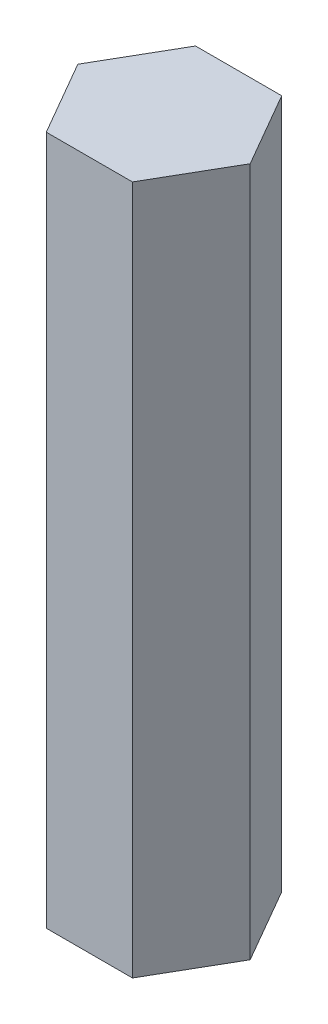
ISO-10303-21;
HEADER;
FILE_DESCRIPTION(('STEP AP214'),'2;1');
FILE_NAME('part.step','',(''),(''),'','','');
FILE_SCHEMA(('AUTOMOTIVE_DESIGN { 1 0 10303 214 1 1 1 1 }'));
ENDSEC;
DATA;
#1=APPLICATION_CONTEXT('core data for automotive mechanical design processes');
#2=APPLICATION_PROTOCOL_DEFINITION('international standard','automotive_design',2000,#1);
#3=PRODUCT_CONTEXT('',#1,'mechanical');
#4=PRODUCT('Part','Part','',(#3));
#5=PRODUCT_RELATED_PRODUCT_CATEGORY('part','',(#4));
#6=PRODUCT_DEFINITION_FORMATION('','',#4);
#7=PRODUCT_DEFINITION_CONTEXT('part definition',#1,'design');
#8=PRODUCT_DEFINITION('design','',#6,#7);
#9=PRODUCT_DEFINITION_SHAPE('','',#8);
#10=(LENGTH_UNIT() NAMED_UNIT(*) SI_UNIT(.MILLI.,.METRE.));
#11=(NAMED_UNIT(*) PLANE_ANGLE_UNIT() SI_UNIT($,.RADIAN.));
#12=(NAMED_UNIT(*) SI_UNIT($,.STERADIAN.) SOLID_ANGLE_UNIT());
#13=UNCERTAINTY_MEASURE_WITH_UNIT(LENGTH_MEASURE(1.E-05),#10,'distance_accuracy_value','');
#14=(GEOMETRIC_REPRESENTATION_CONTEXT(3) GLOBAL_UNCERTAINTY_ASSIGNED_CONTEXT((#13)) GLOBAL_UNIT_ASSIGNED_CONTEXT((#10,
#11,#12)) REPRESENTATION_CONTEXT('',''));
#15=CARTESIAN_POINT('',(0.,0.,0.));
#16=DIRECTION('',(0.,0.,1.));
#17=DIRECTION('',(1.,0.,0.));
#18=AXIS2_PLACEMENT_3D('',#15,#16,#17);
#19=CARTESIAN_POINT('',(3.,24.,0.));
#20=DIRECTION('',(-0.866025403784439,0.,0.5));
#21=DIRECTION('',(0.5,0.,0.866025403784439));
#22=AXIS2_PLACEMENT_3D('',#19,#20,#21);
#23=PLANE('',#22);
#24=DIRECTION('',(-0.5,0.,-0.866025403784439));
#25=VECTOR('',#24,1.);
#26=CARTESIAN_POINT('',(3.,0.,0.));
#27=LINE('',#26,#25);
#28=CARTESIAN_POINT('',(3.,0.,0.));
#29=VERTEX_POINT('',#28);
#30=CARTESIAN_POINT('',(1.5,0.,-2.59807621135332));
#31=VERTEX_POINT('',#30);
#32=EDGE_CURVE('E117',#29,#31,#27,.T.);
#33=ORIENTED_EDGE('',*,*,#32,.T.);
#34=DIRECTION('',(0.,-1.,0.));
#35=VECTOR('',#34,1.);
#36=CARTESIAN_POINT('',(1.5,24.,-2.59807621135332));
#37=LINE('',#36,#35);
#38=CARTESIAN_POINT('',(1.5,24.,-2.59807621135332));
#39=VERTEX_POINT('',#38);
#40=EDGE_CURVE('E11',#39,#31,#37,.T.);
#41=ORIENTED_EDGE('',*,*,#40,.F.);
#42=DIRECTION('',(-0.5,0.,-0.866025403784439));
#43=VECTOR('',#42,1.);
#44=CARTESIAN_POINT('',(3.,24.,0.));
#45=LINE('',#44,#43);
#46=CARTESIAN_POINT('',(3.,24.,0.));
#47=VERTEX_POINT('',#46);
#48=EDGE_CURVE('E127',#47,#39,#45,.T.);
#49=ORIENTED_EDGE('',*,*,#48,.F.);
#50=DIRECTION('',(0.,-1.,0.));
#51=VECTOR('',#50,1.);
#52=CARTESIAN_POINT('',(3.,24.,0.));
#53=LINE('',#52,#51);
#54=EDGE_CURVE('E113',#47,#29,#53,.T.);
#55=ORIENTED_EDGE('',*,*,#54,.T.);
#56=EDGE_LOOP('',(#33,#41,#49,#55));
#57=FACE_BOUND('',#56,.T.);
#58=ADVANCED_FACE('F33',(#57),#23,.F.);
#59=CARTESIAN_POINT('',(1.5,24.,-2.59807621135332));
#60=DIRECTION('',(0.,0.,1.));
#61=DIRECTION('',(1.,0.,0.));
#62=AXIS2_PLACEMENT_3D('',#59,#60,#61);
#63=PLANE('',#62);
#64=DIRECTION('',(-1.,0.,0.));
#65=VECTOR('',#64,1.);
#66=CARTESIAN_POINT('',(1.5,0.,-2.59807621135332));
#67=LINE('',#66,#65);
#68=CARTESIAN_POINT('',(-1.5,0.,-2.59807621135332));
#69=VERTEX_POINT('',#68);
#70=EDGE_CURVE('E120',#31,#69,#67,.T.);
#71=ORIENTED_EDGE('',*,*,#70,.T.);
#72=DIRECTION('',(0.,-1.,0.));
#73=VECTOR('',#72,1.);
#74=CARTESIAN_POINT('',(-1.5,24.,-2.59807621135332));
#75=LINE('',#74,#73);
#76=CARTESIAN_POINT('',(-1.5,24.,-2.59807621135332));
#77=VERTEX_POINT('',#76);
#78=EDGE_CURVE('E41',#77,#69,#75,.T.);
#79=ORIENTED_EDGE('',*,*,#78,.F.);
#80=DIRECTION('',(-1.,0.,0.));
#81=VECTOR('',#80,1.);
#82=CARTESIAN_POINT('',(1.5,24.,-2.59807621135332));
#83=LINE('',#82,#81);
#84=EDGE_CURVE('E86',#39,#77,#83,.T.);
#85=ORIENTED_EDGE('',*,*,#84,.F.);
#86=ORIENTED_EDGE('',*,*,#40,.T.);
#87=EDGE_LOOP('',(#71,#79,#85,#86));
#88=FACE_BOUND('',#87,.T.);
#89=ADVANCED_FACE('F151',(#88),#63,.F.);
#90=CARTESIAN_POINT('',(-1.5,24.,-2.59807621135332));
#91=DIRECTION('',(0.866025403784438,0.,0.5));
#92=DIRECTION('',(0.5,0.,-0.866025403784439));
#93=AXIS2_PLACEMENT_3D('',#90,#91,#92);
#94=PLANE('',#93);
#95=DIRECTION('',(-0.5,0.,0.866025403784439));
#96=VECTOR('',#95,1.);
#97=CARTESIAN_POINT('',(-1.5,0.,-2.59807621135332));
#98=LINE('',#97,#96);
#99=CARTESIAN_POINT('',(-3.,0.,0.));
#100=VERTEX_POINT('',#99);
#101=EDGE_CURVE('E122',#69,#100,#98,.T.);
#102=ORIENTED_EDGE('',*,*,#101,.T.);
#103=DIRECTION('',(0.,-1.,0.));
#104=VECTOR('',#103,1.);
#105=CARTESIAN_POINT('',(-3.,24.,0.));
#106=LINE('',#105,#104);
#107=CARTESIAN_POINT('',(-3.,24.,0.));
#108=VERTEX_POINT('',#107);
#109=EDGE_CURVE('E108',#108,#100,#106,.T.);
#110=ORIENTED_EDGE('',*,*,#109,.F.);
#111=DIRECTION('',(-0.5,0.,0.866025403784439));
#112=VECTOR('',#111,1.);
#113=CARTESIAN_POINT('',(-1.5,24.,-2.59807621135332));
#114=LINE('',#113,#112);
#115=EDGE_CURVE('E99',#77,#108,#114,.T.);
#116=ORIENTED_EDGE('',*,*,#115,.F.);
#117=ORIENTED_EDGE('',*,*,#78,.T.);
#118=EDGE_LOOP('',(#102,#110,#116,#117));
#119=FACE_BOUND('',#118,.T.);
#120=ADVANCED_FACE('F133',(#119),#94,.F.);
#121=CARTESIAN_POINT('',(-3.,24.,0.));
#122=DIRECTION('',(0.866025403784439,0.,-0.5));
#123=DIRECTION('',(-0.5,0.,-0.866025403784439));
#124=AXIS2_PLACEMENT_3D('',#121,#122,#123);
#125=PLANE('',#124);
#126=DIRECTION('',(0.5,0.,0.866025403784439));
#127=VECTOR('',#126,1.);
#128=CARTESIAN_POINT('',(-3.,0.,0.));
#129=LINE('',#128,#127);
#130=CARTESIAN_POINT('',(-1.5,0.,2.59807621135332));
#131=VERTEX_POINT('',#130);
#132=EDGE_CURVE('E107',#100,#131,#129,.T.);
#133=ORIENTED_EDGE('',*,*,#132,.T.);
#134=DIRECTION('',(0.,-1.,0.));
#135=VECTOR('',#134,1.);
#136=CARTESIAN_POINT('',(-1.5,24.,2.59807621135332));
#137=LINE('',#136,#135);
#138=CARTESIAN_POINT('',(-1.5,24.,2.59807621135332));
#139=VERTEX_POINT('',#138);
#140=EDGE_CURVE('E104',#139,#131,#137,.T.);
#141=ORIENTED_EDGE('',*,*,#140,.F.);
#142=DIRECTION('',(0.5,0.,0.866025403784439));
#143=VECTOR('',#142,1.);
#144=CARTESIAN_POINT('',(-3.,24.,0.));
#145=LINE('',#144,#143);
#146=EDGE_CURVE('E93',#108,#139,#145,.T.);
#147=ORIENTED_EDGE('',*,*,#146,.F.);
#148=ORIENTED_EDGE('',*,*,#109,.T.);
#149=EDGE_LOOP('',(#133,#141,#147,#148));
#150=FACE_BOUND('',#149,.T.);
#151=ADVANCED_FACE('F105',(#150),#125,.F.);
#152=CARTESIAN_POINT('',(-1.5,24.,2.59807621135332));
#153=DIRECTION('',(0.,0.,-1.));
#154=DIRECTION('',(-1.,0.,0.));
#155=AXIS2_PLACEMENT_3D('',#152,#153,#154);
#156=PLANE('',#155);
#157=DIRECTION('',(1.,0.,0.));
#158=VECTOR('',#157,1.);
#159=CARTESIAN_POINT('',(-1.5,0.,2.59807621135332));
#160=LINE('',#159,#158);
#161=CARTESIAN_POINT('',(1.5,0.,2.59807621135332));
#162=VERTEX_POINT('',#161);
#163=EDGE_CURVE('E72',#131,#162,#160,.T.);
#164=ORIENTED_EDGE('',*,*,#163,.T.);
#165=DIRECTION('',(0.,-1.,0.));
#166=VECTOR('',#165,1.);
#167=CARTESIAN_POINT('',(1.5,24.,2.59807621135332));
#168=LINE('',#167,#166);
#169=CARTESIAN_POINT('',(1.5,24.,2.59807621135332));
#170=VERTEX_POINT('',#169);
#171=EDGE_CURVE('E109',#170,#162,#168,.T.);
#172=ORIENTED_EDGE('',*,*,#171,.F.);
#173=DIRECTION('',(1.,0.,0.));
#174=VECTOR('',#173,1.);
#175=CARTESIAN_POINT('',(-1.5,24.,2.59807621135332));
#176=LINE('',#175,#174);
#177=EDGE_CURVE('E97',#139,#170,#176,.T.);
#178=ORIENTED_EDGE('',*,*,#177,.F.);
#179=ORIENTED_EDGE('',*,*,#140,.T.);
#180=EDGE_LOOP('',(#164,#172,#178,#179));
#181=FACE_BOUND('',#180,.T.);
#182=ADVANCED_FACE('F111',(#181),#156,.F.);
#183=CARTESIAN_POINT('',(1.5,24.,2.59807621135332));
#184=DIRECTION('',(-0.866025403784438,0.,-0.5));
#185=DIRECTION('',(-0.5,0.,0.866025403784439));
#186=AXIS2_PLACEMENT_3D('',#183,#184,#185);
#187=PLANE('',#186);
#188=DIRECTION('',(0.5,0.,-0.866025403784438));
#189=VECTOR('',#188,1.);
#190=CARTESIAN_POINT('',(1.5,0.,2.59807621135332));
#191=LINE('',#190,#189);
#192=EDGE_CURVE('E78',#162,#29,#191,.T.);
#193=ORIENTED_EDGE('',*,*,#192,.T.);
#194=ORIENTED_EDGE('',*,*,#54,.F.);
#195=DIRECTION('',(0.5,0.,-0.866025403784438));
#196=VECTOR('',#195,1.);
#197=CARTESIAN_POINT('',(1.5,24.,2.59807621135332));
#198=LINE('',#197,#196);
#199=EDGE_CURVE('E49',#170,#47,#198,.T.);
#200=ORIENTED_EDGE('',*,*,#199,.F.);
#201=ORIENTED_EDGE('',*,*,#171,.T.);
#202=EDGE_LOOP('',(#193,#194,#200,#201));
#203=FACE_BOUND('',#202,.T.);
#204=ADVANCED_FACE('F140',(#203),#187,.F.);
#205=CARTESIAN_POINT('',(0.,24.,0.));
#206=DIRECTION('',(0.,1.,0.));
#207=DIRECTION('',(0.,0.,1.));
#208=AXIS2_PLACEMENT_3D('',#205,#206,#207);
#209=PLANE('',#208);
#210=ORIENTED_EDGE('',*,*,#48,.T.);
#211=ORIENTED_EDGE('',*,*,#84,.T.);
#212=ORIENTED_EDGE('',*,*,#115,.T.);
#213=ORIENTED_EDGE('',*,*,#146,.T.);
#214=ORIENTED_EDGE('',*,*,#177,.T.);
#215=ORIENTED_EDGE('',*,*,#199,.T.);
#216=EDGE_LOOP('',(#210,#211,#212,#213,#214,#215));
#217=FACE_BOUND('',#216,.T.);
#218=ADVANCED_FACE('F95',(#217),#209,.T.);
#219=CARTESIAN_POINT('',(0.,0.,0.));
#220=DIRECTION('',(0.,1.,0.));
#221=DIRECTION('',(0.,0.,1.));
#222=AXIS2_PLACEMENT_3D('',#219,#220,#221);
#223=PLANE('',#222);
#224=ORIENTED_EDGE('',*,*,#32,.F.);
#225=ORIENTED_EDGE('',*,*,#192,.F.);
#226=ORIENTED_EDGE('',*,*,#163,.F.);
#227=ORIENTED_EDGE('',*,*,#132,.F.);
#228=ORIENTED_EDGE('',*,*,#101,.F.);
#229=ORIENTED_EDGE('',*,*,#70,.F.);
#230=EDGE_LOOP('',(#224,#225,#226,#227,#228,#229));
#231=FACE_BOUND('',#230,.T.);
#232=ADVANCED_FACE('F136',(#231),#223,.F.);
#233=CLOSED_SHELL('',(#58,#89,#120,#151,#182,#204,#218,#232));
#234=MANIFOLD_SOLID_BREP('B2',#233);
#235=ADVANCED_BREP_SHAPE_REPRESENTATION('',(#18,#234),#14);
#236=SHAPE_DEFINITION_REPRESENTATION(#9,#235);
ENDSEC;
END-ISO-10303-21;
